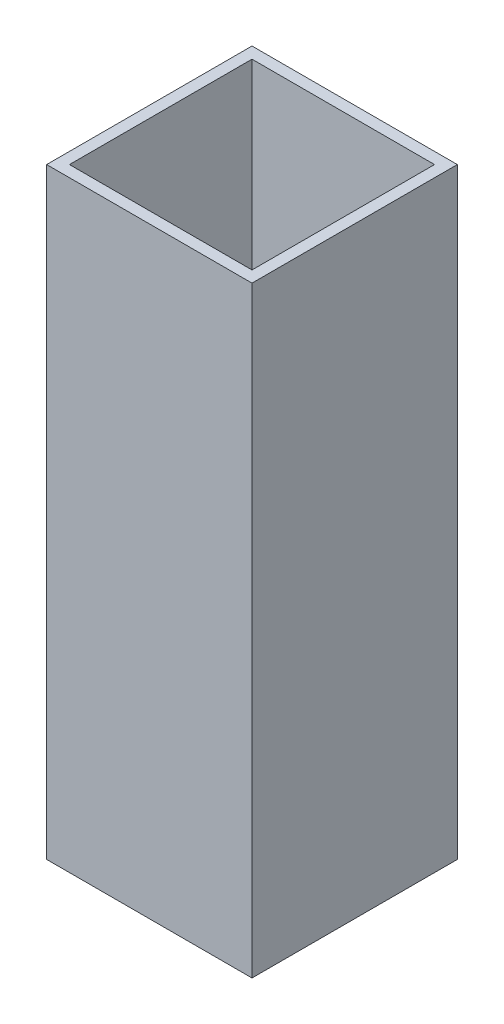
ISO-10303-21;
HEADER;
FILE_DESCRIPTION(('STEP AP214'),'2;1');
FILE_NAME('part.step','',(''),(''),'','','');
FILE_SCHEMA(('AUTOMOTIVE_DESIGN { 1 0 10303 214 1 1 1 1 }'));
ENDSEC;
DATA;
#1=APPLICATION_CONTEXT('core data for automotive mechanical design processes');
#2=APPLICATION_PROTOCOL_DEFINITION('international standard','automotive_design',2000,#1);
#3=PRODUCT_CONTEXT('',#1,'mechanical');
#4=PRODUCT('Part','Part','',(#3));
#5=PRODUCT_RELATED_PRODUCT_CATEGORY('part','',(#4));
#6=PRODUCT_DEFINITION_FORMATION('','',#4);
#7=PRODUCT_DEFINITION_CONTEXT('part definition',#1,'design');
#8=PRODUCT_DEFINITION('design','',#6,#7);
#9=PRODUCT_DEFINITION_SHAPE('','',#8);
#10=(LENGTH_UNIT() NAMED_UNIT(*) SI_UNIT(.MILLI.,.METRE.));
#11=(NAMED_UNIT(*) PLANE_ANGLE_UNIT() SI_UNIT($,.RADIAN.));
#12=(NAMED_UNIT(*) SI_UNIT($,.STERADIAN.) SOLID_ANGLE_UNIT());
#13=UNCERTAINTY_MEASURE_WITH_UNIT(LENGTH_MEASURE(1.E-05),#10,'distance_accuracy_value','');
#14=(GEOMETRIC_REPRESENTATION_CONTEXT(3) GLOBAL_UNCERTAINTY_ASSIGNED_CONTEXT((#13)) GLOBAL_UNIT_ASSIGNED_CONTEXT((#10,
#11,#12)) REPRESENTATION_CONTEXT('',''));
#15=CARTESIAN_POINT('',(0.,0.,0.));
#16=DIRECTION('',(0.,0.,1.));
#17=DIRECTION('',(1.,0.,0.));
#18=AXIS2_PLACEMENT_3D('',#15,#16,#17);
#19=CARTESIAN_POINT('',(-79.0444738201403,10.,-50.0092772389049));
#20=DIRECTION('',(1.,0.,0.));
#21=DIRECTION('',(0.,0.,-1.));
#22=AXIS2_PLACEMENT_3D('',#19,#20,#21);
#23=PLANE('',#22);
#24=DIRECTION('',(0.,-1.,0.));
#25=VECTOR('',#24,1.);
#26=CARTESIAN_POINT('',(-79.0444738201403,10.,-50.0092772389049));
#27=LINE('',#26,#25);
#28=CARTESIAN_POINT('',(-79.0444738201403,73.5,-50.0092772389049));
#29=VERTEX_POINT('',#28);
#30=CARTESIAN_POINT('',(-79.0444738201403,-32.,-50.0092772389049));
#31=VERTEX_POINT('',#30);
#32=EDGE_CURVE('E278',#29,#31,#27,.T.);
#33=ORIENTED_EDGE('',*,*,#32,.T.);
#34=DIRECTION('',(0.,0.,-1.));
#35=VECTOR('',#34,1.);
#36=CARTESIAN_POINT('',(-79.0444738201403,-32.,-14.0092772389049));
#37=LINE('',#36,#35);
#38=CARTESIAN_POINT('',(-79.0444738201403,-32.,-14.0092772389049));
#39=VERTEX_POINT('',#38);
#40=EDGE_CURVE('E168',#39,#31,#37,.T.);
#41=ORIENTED_EDGE('',*,*,#40,.F.);
#42=DIRECTION('',(0.,-1.,0.));
#43=VECTOR('',#42,1.);
#44=CARTESIAN_POINT('',(-79.0444738201403,10.,-14.0092772389049));
#45=LINE('',#44,#43);
#46=CARTESIAN_POINT('',(-79.0444738201403,73.5,-14.0092772389049));
#47=VERTEX_POINT('',#46);
#48=EDGE_CURVE('E11',#47,#39,#45,.T.);
#49=ORIENTED_EDGE('',*,*,#48,.F.);
#50=DIRECTION('',(0.,0.,1.));
#51=VECTOR('',#50,1.);
#52=CARTESIAN_POINT('',(-79.0444738201403,73.5,0.));
#53=LINE('',#52,#51);
#54=EDGE_CURVE('E249',#29,#47,#53,.T.);
#55=ORIENTED_EDGE('',*,*,#54,.F.);
#56=EDGE_LOOP('',(#33,#41,#49,#55));
#57=FACE_BOUND('',#56,.T.);
#58=ADVANCED_FACE('F39',(#57),#23,.F.);
#59=CARTESIAN_POINT('',(-79.0444738201403,10.,-14.0092772389049));
#60=DIRECTION('',(0.,0.,-1.));
#61=DIRECTION('',(-1.,0.,0.));
#62=AXIS2_PLACEMENT_3D('',#59,#60,#61);
#63=PLANE('',#62);
#64=ORIENTED_EDGE('',*,*,#48,.T.);
#65=DIRECTION('',(-1.,0.,0.));
#66=VECTOR('',#65,1.);
#67=CARTESIAN_POINT('',(-79.0444738201403,-32.,-14.0092772389049));
#68=LINE('',#67,#66);
#69=CARTESIAN_POINT('',(-43.0444738201403,-32.,-14.0092772389049));
#70=VERTEX_POINT('',#69);
#71=EDGE_CURVE('E200',#70,#39,#68,.T.);
#72=ORIENTED_EDGE('',*,*,#71,.F.);
#73=DIRECTION('',(0.,-1.,0.));
#74=VECTOR('',#73,1.);
#75=CARTESIAN_POINT('',(-43.0444738201403,10.,-14.0092772389049));
#76=LINE('',#75,#74);
#77=CARTESIAN_POINT('',(-43.0444738201403,73.5,-14.0092772389049));
#78=VERTEX_POINT('',#77);
#79=EDGE_CURVE('E46',#78,#70,#76,.T.);
#80=ORIENTED_EDGE('',*,*,#79,.F.);
#81=DIRECTION('',(1.,0.,0.));
#82=VECTOR('',#81,1.);
#83=CARTESIAN_POINT('',(0.,73.5,-14.0092772389049));
#84=LINE('',#83,#82);
#85=EDGE_CURVE('E252',#47,#78,#84,.T.);
#86=ORIENTED_EDGE('',*,*,#85,.F.);
#87=EDGE_LOOP('',(#64,#72,#80,#86));
#88=FACE_BOUND('',#87,.T.);
#89=ADVANCED_FACE('F291',(#88),#63,.F.);
#90=CARTESIAN_POINT('',(-43.0444738201403,10.,-50.0092772389049));
#91=DIRECTION('',(-1.,0.,0.));
#92=DIRECTION('',(0.,0.,1.));
#93=AXIS2_PLACEMENT_3D('',#90,#91,#92);
#94=PLANE('',#93);
#95=ORIENTED_EDGE('',*,*,#79,.T.);
#96=DIRECTION('',(0.,0.,1.));
#97=VECTOR('',#96,1.);
#98=CARTESIAN_POINT('',(-43.0444738201403,-32.,-14.0092772389049));
#99=LINE('',#98,#97);
#100=CARTESIAN_POINT('',(-43.0444738201403,-32.,-50.0092772389049));
#101=VERTEX_POINT('',#100);
#102=EDGE_CURVE('E197',#101,#70,#99,.T.);
#103=ORIENTED_EDGE('',*,*,#102,.F.);
#104=DIRECTION('',(0.,-1.,0.));
#105=VECTOR('',#104,1.);
#106=CARTESIAN_POINT('',(-43.0444738201403,10.,-50.0092772389049));
#107=LINE('',#106,#105);
#108=CARTESIAN_POINT('',(-43.0444738201403,73.5,-50.0092772389049));
#109=VERTEX_POINT('',#108);
#110=EDGE_CURVE('E280',#109,#101,#107,.T.);
#111=ORIENTED_EDGE('',*,*,#110,.F.);
#112=DIRECTION('',(0.,0.,-1.));
#113=VECTOR('',#112,1.);
#114=CARTESIAN_POINT('',(-43.0444738201403,73.5,0.));
#115=LINE('',#114,#113);
#116=EDGE_CURVE('E255',#78,#109,#115,.T.);
#117=ORIENTED_EDGE('',*,*,#116,.F.);
#118=EDGE_LOOP('',(#95,#103,#111,#117));
#119=FACE_BOUND('',#118,.T.);
#120=ADVANCED_FACE('F284',(#119),#94,.F.);
#121=CARTESIAN_POINT('',(-79.0444738201403,10.,-50.0092772389049));
#122=DIRECTION('',(0.,0.,1.));
#123=DIRECTION('',(1.,0.,0.));
#124=AXIS2_PLACEMENT_3D('',#121,#122,#123);
#125=PLANE('',#124);
#126=ORIENTED_EDGE('',*,*,#110,.T.);
#127=DIRECTION('',(1.,0.,0.));
#128=VECTOR('',#127,1.);
#129=CARTESIAN_POINT('',(-79.0444738201403,-32.,-50.0092772389049));
#130=LINE('',#129,#128);
#131=EDGE_CURVE('E194',#31,#101,#130,.T.);
#132=ORIENTED_EDGE('',*,*,#131,.F.);
#133=ORIENTED_EDGE('',*,*,#32,.F.);
#134=DIRECTION('',(-1.,0.,0.));
#135=VECTOR('',#134,1.);
#136=CARTESIAN_POINT('',(0.,73.5,-50.0092772389049));
#137=LINE('',#136,#135);
#138=EDGE_CURVE('E246',#109,#29,#137,.T.);
#139=ORIENTED_EDGE('',*,*,#138,.F.);
#140=EDGE_LOOP('',(#126,#132,#133,#139));
#141=FACE_BOUND('',#140,.T.);
#142=ADVANCED_FACE('F298',(#141),#125,.F.);
#143=CARTESIAN_POINT('',(-77.0444738201403,10.,-48.0092772389049));
#144=DIRECTION('',(1.,0.,0.));
#145=DIRECTION('',(0.,0.,-1.));
#146=AXIS2_PLACEMENT_3D('',#143,#144,#145);
#147=PLANE('',#146);
#148=DIRECTION('',(0.,0.,1.));
#149=VECTOR('',#148,1.);
#150=CARTESIAN_POINT('',(-77.0444738201403,0.,-48.0092772389049));
#151=LINE('',#150,#149);
#152=CARTESIAN_POINT('',(-77.0444738201403,0.,-48.0092772389049));
#153=VERTEX_POINT('',#152);
#154=CARTESIAN_POINT('',(-77.0444738201403,0.,-16.0092772389049));
#155=VERTEX_POINT('',#154);
#156=EDGE_CURVE('E258',#153,#155,#151,.T.);
#157=ORIENTED_EDGE('',*,*,#156,.F.);
#158=DIRECTION('',(0.,-1.,0.));
#159=VECTOR('',#158,1.);
#160=CARTESIAN_POINT('',(-77.0444738201403,10.,-48.0092772389049));
#161=LINE('',#160,#159);
#162=CARTESIAN_POINT('',(-77.0444738201403,73.5,-48.0092772389049));
#163=VERTEX_POINT('',#162);
#164=EDGE_CURVE('E270',#163,#153,#161,.T.);
#165=ORIENTED_EDGE('',*,*,#164,.F.);
#166=DIRECTION('',(0.,0.,-1.));
#167=VECTOR('',#166,1.);
#168=CARTESIAN_POINT('',(-77.0444738201403,73.5,0.));
#169=LINE('',#168,#167);
#170=CARTESIAN_POINT('',(-77.0444738201403,73.5,-16.0092772389049));
#171=VERTEX_POINT('',#170);
#172=EDGE_CURVE('E240',#171,#163,#169,.T.);
#173=ORIENTED_EDGE('',*,*,#172,.F.);
#174=DIRECTION('',(0.,-1.,0.));
#175=VECTOR('',#174,1.);
#176=CARTESIAN_POINT('',(-77.0444738201403,10.,-16.0092772389049));
#177=LINE('',#176,#175);
#178=EDGE_CURVE('E275',#171,#155,#177,.T.);
#179=ORIENTED_EDGE('',*,*,#178,.T.);
#180=EDGE_LOOP('',(#157,#165,#173,#179));
#181=FACE_BOUND('',#180,.T.);
#182=ADVANCED_FACE('F300',(#181),#147,.T.);
#183=CARTESIAN_POINT('',(-77.0444738201403,10.,-16.0092772389049));
#184=DIRECTION('',(0.,0.,-1.));
#185=DIRECTION('',(-1.,0.,0.));
#186=AXIS2_PLACEMENT_3D('',#183,#184,#185);
#187=PLANE('',#186);
#188=DIRECTION('',(1.,0.,0.));
#189=VECTOR('',#188,1.);
#190=CARTESIAN_POINT('',(-77.0444738201403,0.,-16.0092772389049));
#191=LINE('',#190,#189);
#192=CARTESIAN_POINT('',(-45.0444738201403,0.,-16.0092772389049));
#193=VERTEX_POINT('',#192);
#194=EDGE_CURVE('E261',#155,#193,#191,.T.);
#195=ORIENTED_EDGE('',*,*,#194,.F.);
#196=ORIENTED_EDGE('',*,*,#178,.F.);
#197=DIRECTION('',(-1.,0.,0.));
#198=VECTOR('',#197,1.);
#199=CARTESIAN_POINT('',(0.,73.5,-16.0092772389049));
#200=LINE('',#199,#198);
#201=CARTESIAN_POINT('',(-45.0444738201403,73.5,-16.0092772389049));
#202=VERTEX_POINT('',#201);
#203=EDGE_CURVE('E237',#202,#171,#200,.T.);
#204=ORIENTED_EDGE('',*,*,#203,.F.);
#205=DIRECTION('',(0.,-1.,0.));
#206=VECTOR('',#205,1.);
#207=CARTESIAN_POINT('',(-45.0444738201403,10.,-16.0092772389049));
#208=LINE('',#207,#206);
#209=EDGE_CURVE('E273',#202,#193,#208,.T.);
#210=ORIENTED_EDGE('',*,*,#209,.T.);
#211=EDGE_LOOP('',(#195,#196,#204,#210));
#212=FACE_BOUND('',#211,.T.);
#213=ADVANCED_FACE('F306',(#212),#187,.T.);
#214=CARTESIAN_POINT('',(-45.0444738201403,10.,-48.0092772389049));
#215=DIRECTION('',(-1.,0.,0.));
#216=DIRECTION('',(0.,0.,1.));
#217=AXIS2_PLACEMENT_3D('',#214,#215,#216);
#218=PLANE('',#217);
#219=DIRECTION('',(0.,0.,-1.));
#220=VECTOR('',#219,1.);
#221=CARTESIAN_POINT('',(-45.0444738201403,0.,-48.0092772389049));
#222=LINE('',#221,#220);
#223=CARTESIAN_POINT('',(-45.0444738201403,0.,-48.0092772389049));
#224=VERTEX_POINT('',#223);
#225=EDGE_CURVE('E264',#193,#224,#222,.T.);
#226=ORIENTED_EDGE('',*,*,#225,.F.);
#227=ORIENTED_EDGE('',*,*,#209,.F.);
#228=DIRECTION('',(0.,0.,1.));
#229=VECTOR('',#228,1.);
#230=CARTESIAN_POINT('',(-45.0444738201403,73.5,0.));
#231=LINE('',#230,#229);
#232=CARTESIAN_POINT('',(-45.0444738201403,73.5,-48.0092772389049));
#233=VERTEX_POINT('',#232);
#234=EDGE_CURVE('E234',#233,#202,#231,.T.);
#235=ORIENTED_EDGE('',*,*,#234,.F.);
#236=DIRECTION('',(0.,-1.,0.));
#237=VECTOR('',#236,1.);
#238=CARTESIAN_POINT('',(-45.0444738201403,10.,-48.0092772389049));
#239=LINE('',#238,#237);
#240=EDGE_CURVE('E61',#233,#224,#239,.T.);
#241=ORIENTED_EDGE('',*,*,#240,.T.);
#242=EDGE_LOOP('',(#226,#227,#235,#241));
#243=FACE_BOUND('',#242,.T.);
#244=ADVANCED_FACE('F411',(#243),#218,.T.);
#245=CARTESIAN_POINT('',(-77.0444738201403,10.,-48.0092772389049));
#246=DIRECTION('',(0.,0.,1.));
#247=DIRECTION('',(1.,0.,0.));
#248=AXIS2_PLACEMENT_3D('',#245,#246,#247);
#249=PLANE('',#248);
#250=DIRECTION('',(-1.,0.,0.));
#251=VECTOR('',#250,1.);
#252=CARTESIAN_POINT('',(-77.0444738201403,0.,-48.0092772389049));
#253=LINE('',#252,#251);
#254=EDGE_CURVE('E267',#224,#153,#253,.T.);
#255=ORIENTED_EDGE('',*,*,#254,.F.);
#256=ORIENTED_EDGE('',*,*,#240,.F.);
#257=DIRECTION('',(1.,0.,0.));
#258=VECTOR('',#257,1.);
#259=CARTESIAN_POINT('',(0.,73.5,-48.0092772389049));
#260=LINE('',#259,#258);
#261=EDGE_CURVE('E243',#163,#233,#260,.T.);
#262=ORIENTED_EDGE('',*,*,#261,.F.);
#263=ORIENTED_EDGE('',*,*,#164,.T.);
#264=EDGE_LOOP('',(#255,#256,#262,#263));
#265=FACE_BOUND('',#264,.T.);
#266=ADVANCED_FACE('F407',(#265),#249,.T.);
#267=CARTESIAN_POINT('',(0.,73.5,0.));
#268=DIRECTION('',(0.,1.,0.));
#269=DIRECTION('',(0.,0.,1.));
#270=AXIS2_PLACEMENT_3D('',#267,#268,#269);
#271=PLANE('',#270);
#272=ORIENTED_EDGE('',*,*,#234,.T.);
#273=ORIENTED_EDGE('',*,*,#203,.T.);
#274=ORIENTED_EDGE('',*,*,#172,.T.);
#275=ORIENTED_EDGE('',*,*,#261,.T.);
#276=EDGE_LOOP('',(#272,#273,#274,#275));
#277=FACE_BOUND('',#276,.T.);
#278=ORIENTED_EDGE('',*,*,#138,.T.);
#279=ORIENTED_EDGE('',*,*,#54,.T.);
#280=ORIENTED_EDGE('',*,*,#85,.T.);
#281=ORIENTED_EDGE('',*,*,#116,.T.);
#282=EDGE_LOOP('',(#278,#279,#280,#281));
#283=FACE_BOUND('',#282,.T.);
#284=ADVANCED_FACE('F295',(#277,#283),#271,.T.);
#285=CARTESIAN_POINT('',(0.,-2.,0.));
#286=DIRECTION('',(0.,1.,0.));
#287=DIRECTION('',(0.,0.,1.));
#288=AXIS2_PLACEMENT_3D('',#285,#286,#287);
#289=PLANE('',#288);
#290=DIRECTION('',(-1.,0.,0.));
#291=VECTOR('',#290,1.);
#292=CARTESIAN_POINT('',(-77.0444738201403,-2.,-16.0092772389049));
#293=LINE('',#292,#291);
#294=CARTESIAN_POINT('',(-45.0444738201403,-2.,-16.0092772389049));
#295=VERTEX_POINT('',#294);
#296=CARTESIAN_POINT('',(-77.0444738201403,-2.,-16.0092772389049));
#297=VERTEX_POINT('',#296);
#298=EDGE_CURVE('E161',#295,#297,#293,.T.);
#299=ORIENTED_EDGE('',*,*,#298,.T.);
#300=DIRECTION('',(0.,0.,-1.));
#301=VECTOR('',#300,1.);
#302=CARTESIAN_POINT('',(-77.0444738201403,-2.,-16.0092772389049));
#303=LINE('',#302,#301);
#304=CARTESIAN_POINT('',(-77.0444738201403,-2.,-48.0092772389049));
#305=VERTEX_POINT('',#304);
#306=EDGE_CURVE('E180',#297,#305,#303,.T.);
#307=ORIENTED_EDGE('',*,*,#306,.T.);
#308=DIRECTION('',(1.,0.,0.));
#309=VECTOR('',#308,1.);
#310=CARTESIAN_POINT('',(-77.0444738201403,-2.,-48.0092772389049));
#311=LINE('',#310,#309);
#312=CARTESIAN_POINT('',(-45.0444738201403,-2.,-48.0092772389049));
#313=VERTEX_POINT('',#312);
#314=EDGE_CURVE('E167',#305,#313,#311,.T.);
#315=ORIENTED_EDGE('',*,*,#314,.T.);
#316=DIRECTION('',(0.,0.,1.));
#317=VECTOR('',#316,1.);
#318=CARTESIAN_POINT('',(-45.0444738201403,-2.,-16.0092772389049));
#319=LINE('',#318,#317);
#320=EDGE_CURVE('E183',#313,#295,#319,.T.);
#321=ORIENTED_EDGE('',*,*,#320,.T.);
#322=EDGE_LOOP('',(#299,#307,#315,#321));
#323=FACE_BOUND('',#322,.T.);
#324=DIRECTION('',(0.,0.,-1.));
#325=VECTOR('',#324,1.);
#326=CARTESIAN_POINT('',(-75.0444738201403,-2.,-18.0092772389049));
#327=LINE('',#326,#325);
#328=CARTESIAN_POINT('',(-75.0444738201403,-2.,-18.0092772389049));
#329=VERTEX_POINT('',#328);
#330=CARTESIAN_POINT('',(-75.0444738201403,-2.,-46.0092772389049));
#331=VERTEX_POINT('',#330);
#332=EDGE_CURVE('E204',#329,#331,#327,.T.);
#333=ORIENTED_EDGE('',*,*,#332,.F.);
#334=DIRECTION('',(-1.,0.,0.));
#335=VECTOR('',#334,1.);
#336=CARTESIAN_POINT('',(-75.0444738201403,-2.,-18.0092772389049));
#337=LINE('',#336,#335);
#338=CARTESIAN_POINT('',(-47.0444738201403,-2.,-18.0092772389049));
#339=VERTEX_POINT('',#338);
#340=EDGE_CURVE('E212',#339,#329,#337,.T.);
#341=ORIENTED_EDGE('',*,*,#340,.F.);
#342=DIRECTION('',(0.,0.,1.));
#343=VECTOR('',#342,1.);
#344=CARTESIAN_POINT('',(-47.0444738201403,-2.,-18.0092772389049));
#345=LINE('',#344,#343);
#346=CARTESIAN_POINT('',(-47.0444738201403,-2.,-46.0092772389049));
#347=VERTEX_POINT('',#346);
#348=EDGE_CURVE('E209',#347,#339,#345,.T.);
#349=ORIENTED_EDGE('',*,*,#348,.F.);
#350=DIRECTION('',(1.,0.,0.));
#351=VECTOR('',#350,1.);
#352=CARTESIAN_POINT('',(-75.0444738201403,-2.,-46.0092772389049));
#353=LINE('',#352,#351);
#354=EDGE_CURVE('E206',#331,#347,#353,.T.);
#355=ORIENTED_EDGE('',*,*,#354,.F.);
#356=EDGE_LOOP('',(#333,#341,#349,#355));
#357=FACE_BOUND('',#356,.T.);
#358=ADVANCED_FACE('F332',(#323,#357),#289,.F.);
#359=CARTESIAN_POINT('',(0.,0.,0.));
#360=DIRECTION('',(0.,1.,0.));
#361=DIRECTION('',(0.,0.,1.));
#362=AXIS2_PLACEMENT_3D('',#359,#360,#361);
#363=PLANE('',#362);
#364=ORIENTED_EDGE('',*,*,#254,.T.);
#365=ORIENTED_EDGE('',*,*,#156,.T.);
#366=ORIENTED_EDGE('',*,*,#194,.T.);
#367=ORIENTED_EDGE('',*,*,#225,.T.);
#368=EDGE_LOOP('',(#364,#365,#366,#367));
#369=FACE_BOUND('',#368,.T.);
#370=DIRECTION('',(-1.,0.,0.));
#371=VECTOR('',#370,1.);
#372=CARTESIAN_POINT('',(-75.0444738201403,0.,-18.0092772389049));
#373=LINE('',#372,#371);
#374=CARTESIAN_POINT('',(-47.0444738201403,0.,-18.0092772389049));
#375=VERTEX_POINT('',#374);
#376=CARTESIAN_POINT('',(-75.0444738201403,0.,-18.0092772389049));
#377=VERTEX_POINT('',#376);
#378=EDGE_CURVE('E207',#375,#377,#373,.T.);
#379=ORIENTED_EDGE('',*,*,#378,.T.);
#380=DIRECTION('',(0.,0.,-1.));
#381=VECTOR('',#380,1.);
#382=CARTESIAN_POINT('',(-75.0444738201403,0.,-18.0092772389049));
#383=LINE('',#382,#381);
#384=CARTESIAN_POINT('',(-75.0444738201403,0.,-46.0092772389049));
#385=VERTEX_POINT('',#384);
#386=EDGE_CURVE('E203',#377,#385,#383,.T.);
#387=ORIENTED_EDGE('',*,*,#386,.T.);
#388=DIRECTION('',(1.,0.,0.));
#389=VECTOR('',#388,1.);
#390=CARTESIAN_POINT('',(-75.0444738201403,0.,-46.0092772389049));
#391=LINE('',#390,#389);
#392=CARTESIAN_POINT('',(-47.0444738201403,0.,-46.0092772389049));
#393=VERTEX_POINT('',#392);
#394=EDGE_CURVE('E217',#385,#393,#391,.T.);
#395=ORIENTED_EDGE('',*,*,#394,.T.);
#396=DIRECTION('',(0.,0.,1.));
#397=VECTOR('',#396,1.);
#398=CARTESIAN_POINT('',(-47.0444738201403,0.,-18.0092772389049));
#399=LINE('',#398,#397);
#400=EDGE_CURVE('E220',#393,#375,#399,.T.);
#401=ORIENTED_EDGE('',*,*,#400,.T.);
#402=EDGE_LOOP('',(#379,#387,#395,#401));
#403=FACE_BOUND('',#402,.T.);
#404=ADVANCED_FACE('F337',(#369,#403),#363,.T.);
#405=CARTESIAN_POINT('',(-75.0444738201403,-2.,-18.0092772389049));
#406=DIRECTION('',(1.,0.,0.));
#407=DIRECTION('',(0.,0.,-1.));
#408=AXIS2_PLACEMENT_3D('',#405,#406,#407);
#409=PLANE('',#408);
#410=ORIENTED_EDGE('',*,*,#386,.F.);
#411=DIRECTION('',(0.,1.,0.));
#412=VECTOR('',#411,1.);
#413=CARTESIAN_POINT('',(-75.0444738201403,-2.,-18.0092772389049));
#414=LINE('',#413,#412);
#415=EDGE_CURVE('E214',#329,#377,#414,.T.);
#416=ORIENTED_EDGE('',*,*,#415,.F.);
#417=ORIENTED_EDGE('',*,*,#332,.T.);
#418=DIRECTION('',(0.,1.,0.));
#419=VECTOR('',#418,1.);
#420=CARTESIAN_POINT('',(-75.0444738201403,-2.,-46.0092772389049));
#421=LINE('',#420,#419);
#422=EDGE_CURVE('E231',#331,#385,#421,.T.);
#423=ORIENTED_EDGE('',*,*,#422,.T.);
#424=EDGE_LOOP('',(#410,#416,#417,#423));
#425=FACE_BOUND('',#424,.T.);
#426=ADVANCED_FACE('F399',(#425),#409,.T.);
#427=CARTESIAN_POINT('',(-75.0444738201403,-2.,-46.0092772389049));
#428=DIRECTION('',(0.,0.,1.));
#429=DIRECTION('',(1.,0.,0.));
#430=AXIS2_PLACEMENT_3D('',#427,#428,#429);
#431=PLANE('',#430);
#432=ORIENTED_EDGE('',*,*,#394,.F.);
#433=ORIENTED_EDGE('',*,*,#422,.F.);
#434=ORIENTED_EDGE('',*,*,#354,.T.);
#435=DIRECTION('',(0.,1.,0.));
#436=VECTOR('',#435,1.);
#437=CARTESIAN_POINT('',(-47.0444738201403,-2.,-46.0092772389049));
#438=LINE('',#437,#436);
#439=EDGE_CURVE('E229',#347,#393,#438,.T.);
#440=ORIENTED_EDGE('',*,*,#439,.T.);
#441=EDGE_LOOP('',(#432,#433,#434,#440));
#442=FACE_BOUND('',#441,.T.);
#443=ADVANCED_FACE('F395',(#442),#431,.T.);
#444=CARTESIAN_POINT('',(-47.0444738201403,-2.,-18.0092772389049));
#445=DIRECTION('',(-1.,0.,0.));
#446=DIRECTION('',(0.,0.,1.));
#447=AXIS2_PLACEMENT_3D('',#444,#445,#446);
#448=PLANE('',#447);
#449=ORIENTED_EDGE('',*,*,#400,.F.);
#450=ORIENTED_EDGE('',*,*,#439,.F.);
#451=ORIENTED_EDGE('',*,*,#348,.T.);
#452=DIRECTION('',(0.,1.,0.));
#453=VECTOR('',#452,1.);
#454=CARTESIAN_POINT('',(-47.0444738201403,-2.,-18.0092772389049));
#455=LINE('',#454,#453);
#456=EDGE_CURVE('E227',#339,#375,#455,.T.);
#457=ORIENTED_EDGE('',*,*,#456,.T.);
#458=EDGE_LOOP('',(#449,#450,#451,#457));
#459=FACE_BOUND('',#458,.T.);
#460=ADVANCED_FACE('F391',(#459),#448,.T.);
#461=CARTESIAN_POINT('',(-75.0444738201403,-2.,-18.0092772389049));
#462=DIRECTION('',(0.,0.,-1.));
#463=DIRECTION('',(-1.,0.,0.));
#464=AXIS2_PLACEMENT_3D('',#461,#462,#463);
#465=PLANE('',#464);
#466=ORIENTED_EDGE('',*,*,#378,.F.);
#467=ORIENTED_EDGE('',*,*,#456,.F.);
#468=ORIENTED_EDGE('',*,*,#340,.T.);
#469=ORIENTED_EDGE('',*,*,#415,.T.);
#470=EDGE_LOOP('',(#466,#467,#468,#469));
#471=FACE_BOUND('',#470,.T.);
#472=ADVANCED_FACE('F349',(#471),#465,.T.);
#473=CARTESIAN_POINT('',(0.,-32.,0.));
#474=DIRECTION('',(0.,-1.,0.));
#475=DIRECTION('',(0.,0.,-1.));
#476=AXIS2_PLACEMENT_3D('',#473,#474,#475);
#477=PLANE('',#476);
#478=ORIENTED_EDGE('',*,*,#40,.T.);
#479=ORIENTED_EDGE('',*,*,#131,.T.);
#480=ORIENTED_EDGE('',*,*,#102,.T.);
#481=ORIENTED_EDGE('',*,*,#71,.T.);
#482=EDGE_LOOP('',(#478,#479,#480,#481));
#483=FACE_BOUND('',#482,.T.);
#484=DIRECTION('',(1.,0.,0.));
#485=VECTOR('',#484,1.);
#486=CARTESIAN_POINT('',(-77.0444738201403,-32.,-48.0092772389049));
#487=LINE('',#486,#485);
#488=CARTESIAN_POINT('',(-77.0444738201403,-32.,-48.0092772389049));
#489=VERTEX_POINT('',#488);
#490=CARTESIAN_POINT('',(-45.0444738201403,-32.,-48.0092772389049));
#491=VERTEX_POINT('',#490);
#492=EDGE_CURVE('E160',#489,#491,#487,.T.);
#493=ORIENTED_EDGE('',*,*,#492,.F.);
#494=DIRECTION('',(0.,0.,-1.));
#495=VECTOR('',#494,1.);
#496=CARTESIAN_POINT('',(-77.0444738201403,-32.,-16.0092772389049));
#497=LINE('',#496,#495);
#498=CARTESIAN_POINT('',(-77.0444738201403,-32.,-16.0092772389049));
#499=VERTEX_POINT('',#498);
#500=EDGE_CURVE('E152',#499,#489,#497,.T.);
#501=ORIENTED_EDGE('',*,*,#500,.F.);
#502=DIRECTION('',(-1.,0.,0.));
#503=VECTOR('',#502,1.);
#504=CARTESIAN_POINT('',(-77.0444738201403,-32.,-16.0092772389049));
#505=LINE('',#504,#503);
#506=CARTESIAN_POINT('',(-45.0444738201403,-32.,-16.0092772389049));
#507=VERTEX_POINT('',#506);
#508=EDGE_CURVE('E176',#507,#499,#505,.T.);
#509=ORIENTED_EDGE('',*,*,#508,.F.);
#510=DIRECTION('',(0.,0.,1.));
#511=VECTOR('',#510,1.);
#512=CARTESIAN_POINT('',(-45.0444738201403,-32.,-16.0092772389049));
#513=LINE('',#512,#511);
#514=EDGE_CURVE('E174',#491,#507,#513,.T.);
#515=ORIENTED_EDGE('',*,*,#514,.F.);
#516=EDGE_LOOP('',(#493,#501,#509,#515));
#517=FACE_BOUND('',#516,.T.);
#518=ADVANCED_FACE('F172',(#483,#517),#477,.T.);
#519=CARTESIAN_POINT('',(-77.0444738201403,-32.,-16.0092772389049));
#520=DIRECTION('',(1.,0.,0.));
#521=DIRECTION('',(0.,0.,-1.));
#522=AXIS2_PLACEMENT_3D('',#519,#520,#521);
#523=PLANE('',#522);
#524=ORIENTED_EDGE('',*,*,#306,.F.);
#525=DIRECTION('',(0.,1.,0.));
#526=VECTOR('',#525,1.);
#527=CARTESIAN_POINT('',(-77.0444738201403,-32.,-16.0092772389049));
#528=LINE('',#527,#526);
#529=EDGE_CURVE('E53',#499,#297,#528,.T.);
#530=ORIENTED_EDGE('',*,*,#529,.F.);
#531=ORIENTED_EDGE('',*,*,#500,.T.);
#532=DIRECTION('',(0.,1.,0.));
#533=VECTOR('',#532,1.);
#534=CARTESIAN_POINT('',(-77.0444738201403,-32.,-48.0092772389049));
#535=LINE('',#534,#533);
#536=EDGE_CURVE('E155',#489,#305,#535,.T.);
#537=ORIENTED_EDGE('',*,*,#536,.T.);
#538=EDGE_LOOP('',(#524,#530,#531,#537));
#539=FACE_BOUND('',#538,.T.);
#540=ADVANCED_FACE('F154',(#539),#523,.T.);
#541=CARTESIAN_POINT('',(-77.0444738201403,-32.,-48.0092772389049));
#542=DIRECTION('',(0.,0.,1.));
#543=DIRECTION('',(1.,0.,0.));
#544=AXIS2_PLACEMENT_3D('',#541,#542,#543);
#545=PLANE('',#544);
#546=ORIENTED_EDGE('',*,*,#314,.F.);
#547=ORIENTED_EDGE('',*,*,#536,.F.);
#548=ORIENTED_EDGE('',*,*,#492,.T.);
#549=DIRECTION('',(0.,1.,0.));
#550=VECTOR('',#549,1.);
#551=CARTESIAN_POINT('',(-45.0444738201403,-32.,-48.0092772389049));
#552=LINE('',#551,#550);
#553=EDGE_CURVE('E169',#491,#313,#552,.T.);
#554=ORIENTED_EDGE('',*,*,#553,.T.);
#555=EDGE_LOOP('',(#546,#547,#548,#554));
#556=FACE_BOUND('',#555,.T.);
#557=ADVANCED_FACE('F164',(#556),#545,.T.);
#558=CARTESIAN_POINT('',(-45.0444738201403,-32.,-16.0092772389049));
#559=DIRECTION('',(-1.,0.,0.));
#560=DIRECTION('',(0.,0.,1.));
#561=AXIS2_PLACEMENT_3D('',#558,#559,#560);
#562=PLANE('',#561);
#563=ORIENTED_EDGE('',*,*,#320,.F.);
#564=ORIENTED_EDGE('',*,*,#553,.F.);
#565=ORIENTED_EDGE('',*,*,#514,.T.);
#566=DIRECTION('',(0.,1.,0.));
#567=VECTOR('',#566,1.);
#568=CARTESIAN_POINT('',(-45.0444738201403,-32.,-16.0092772389049));
#569=LINE('',#568,#567);
#570=EDGE_CURVE('E189',#507,#295,#569,.T.);
#571=ORIENTED_EDGE('',*,*,#570,.T.);
#572=EDGE_LOOP('',(#563,#564,#565,#571));
#573=FACE_BOUND('',#572,.T.);
#574=ADVANCED_FACE('F367',(#573),#562,.T.);
#575=CARTESIAN_POINT('',(-77.0444738201403,-32.,-16.0092772389049));
#576=DIRECTION('',(0.,0.,-1.));
#577=DIRECTION('',(-1.,0.,0.));
#578=AXIS2_PLACEMENT_3D('',#575,#576,#577);
#579=PLANE('',#578);
#580=ORIENTED_EDGE('',*,*,#298,.F.);
#581=ORIENTED_EDGE('',*,*,#570,.F.);
#582=ORIENTED_EDGE('',*,*,#508,.T.);
#583=ORIENTED_EDGE('',*,*,#529,.T.);
#584=EDGE_LOOP('',(#580,#581,#582,#583));
#585=FACE_BOUND('',#584,.T.);
#586=ADVANCED_FACE('F376',(#585),#579,.T.);
#587=CLOSED_SHELL('',(#58,#89,#120,#142,#182,#213,#244,#266,#284,#358,#404,#426,#443,#460,#472,
#518,#540,#557,#574,#586));
#588=MANIFOLD_SOLID_BREP('B2',#587);
#589=ADVANCED_BREP_SHAPE_REPRESENTATION('',(#18,#588),#14);
#590=SHAPE_DEFINITION_REPRESENTATION(#9,#589);
ENDSEC;
END-ISO-10303-21;
